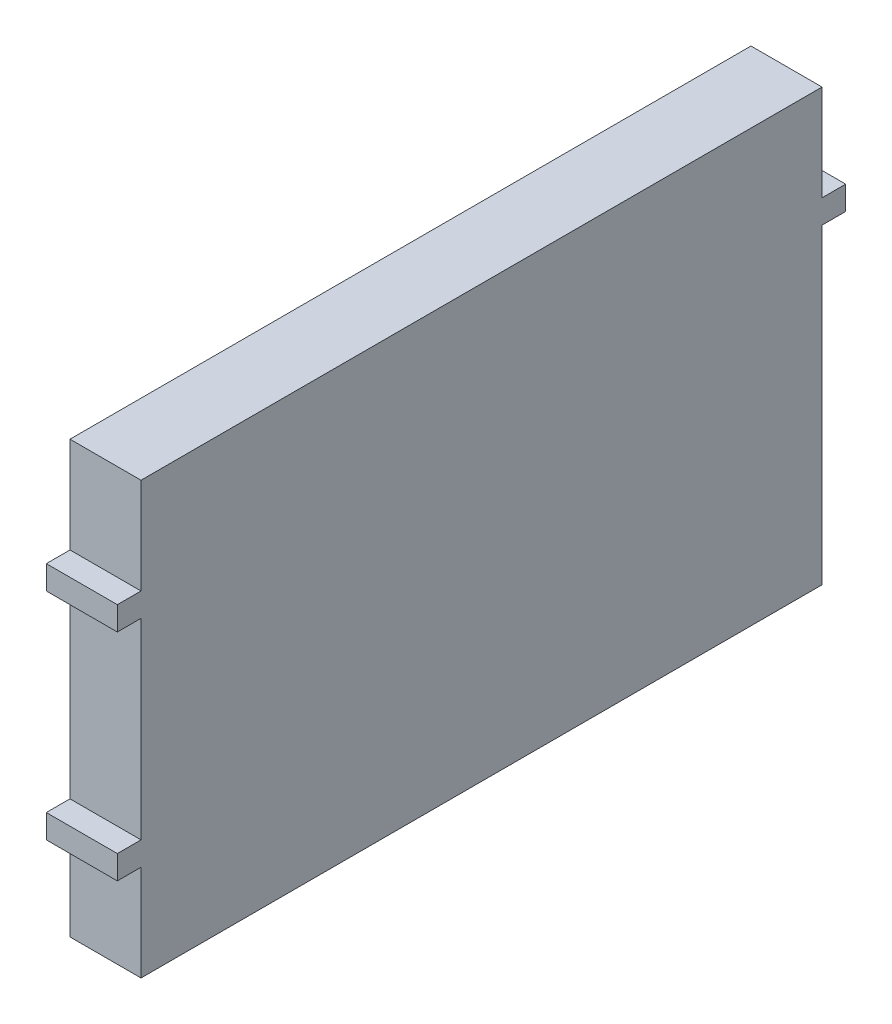
ISO-10303-21;
HEADER;
FILE_DESCRIPTION(('STEP AP214'),'2;1');
FILE_NAME('part.step','',(''),(''),'','','');
FILE_SCHEMA(('AUTOMOTIVE_DESIGN { 1 0 10303 214 1 1 1 1 }'));
ENDSEC;
DATA;
#1=APPLICATION_CONTEXT('core data for automotive mechanical design processes');
#2=APPLICATION_PROTOCOL_DEFINITION('international standard','automotive_design',2000,#1);
#3=PRODUCT_CONTEXT('',#1,'mechanical');
#4=PRODUCT('Part','Part','',(#3));
#5=PRODUCT_RELATED_PRODUCT_CATEGORY('part','',(#4));
#6=PRODUCT_DEFINITION_FORMATION('','',#4);
#7=PRODUCT_DEFINITION_CONTEXT('part definition',#1,'design');
#8=PRODUCT_DEFINITION('design','',#6,#7);
#9=PRODUCT_DEFINITION_SHAPE('','',#8);
#10=(LENGTH_UNIT() NAMED_UNIT(*) SI_UNIT(.MILLI.,.METRE.));
#11=(NAMED_UNIT(*) PLANE_ANGLE_UNIT() SI_UNIT($,.RADIAN.));
#12=(NAMED_UNIT(*) SI_UNIT($,.STERADIAN.) SOLID_ANGLE_UNIT());
#13=UNCERTAINTY_MEASURE_WITH_UNIT(LENGTH_MEASURE(1.E-05),#10,'distance_accuracy_value','');
#14=(GEOMETRIC_REPRESENTATION_CONTEXT(3) GLOBAL_UNCERTAINTY_ASSIGNED_CONTEXT((#13)) GLOBAL_UNIT_ASSIGNED_CONTEXT((#10,
#11,#12)) REPRESENTATION_CONTEXT('',''));
#15=CARTESIAN_POINT('',(0.,0.,0.));
#16=DIRECTION('',(0.,0.,1.));
#17=DIRECTION('',(1.,0.,0.));
#18=AXIS2_PLACEMENT_3D('',#15,#16,#17);
#19=CARTESIAN_POINT('',(365.992991784874,377.766708454733,776.88119407791));
#20=DIRECTION('',(0.,0.,-1.));
#21=DIRECTION('',(-1.,0.,0.));
#22=AXIS2_PLACEMENT_3D('',#19,#20,#21);
#23=PLANE('',#22);
#24=DIRECTION('',(0.,-1.,0.));
#25=VECTOR('',#24,1.);
#26=CARTESIAN_POINT('',(252.542706630704,377.766708454733,776.88119407791));
#27=LINE('',#26,#25);
#28=CARTESIAN_POINT('',(252.542706630704,377.766708454733,776.88119407791));
#29=VERTEX_POINT('',#28);
#30=CARTESIAN_POINT('',(252.542706630704,374.591708454733,776.88119407791));
#31=VERTEX_POINT('',#30);
#32=EDGE_CURVE('E204',#29,#31,#27,.T.);
#33=ORIENTED_EDGE('',*,*,#32,.F.);
#34=DIRECTION('',(-1.,0.,0.));
#35=VECTOR('',#34,1.);
#36=CARTESIAN_POINT('',(365.992991784874,377.766708454733,776.88119407791));
#37=LINE('',#36,#35);
#38=CARTESIAN_POINT('',(243.017706630704,377.766708454733,776.88119407791));
#39=VERTEX_POINT('',#38);
#40=EDGE_CURVE('E37',#29,#39,#37,.T.);
#41=ORIENTED_EDGE('',*,*,#40,.T.);
#42=DIRECTION('',(0.,-1.,0.));
#43=VECTOR('',#42,1.);
#44=CARTESIAN_POINT('',(243.017706630704,377.766708454733,776.88119407791));
#45=LINE('',#44,#43);
#46=CARTESIAN_POINT('',(243.017706630704,374.591708454733,776.88119407791));
#47=VERTEX_POINT('',#46);
#48=EDGE_CURVE('E212',#39,#47,#45,.T.);
#49=ORIENTED_EDGE('',*,*,#48,.T.);
#50=DIRECTION('',(-1.,0.,0.));
#51=VECTOR('',#50,1.);
#52=CARTESIAN_POINT('',(365.992991784874,374.591708454733,776.88119407791));
#53=LINE('',#52,#51);
#54=EDGE_CURVE('E120',#31,#47,#53,.T.);
#55=ORIENTED_EDGE('',*,*,#54,.F.);
#56=EDGE_LOOP('',(#33,#41,#49,#55));
#57=FACE_BOUND('',#56,.T.);
#58=ADVANCED_FACE('F33',(#57),#23,.F.);
#59=CARTESIAN_POINT('',(365.992991784874,374.591708454733,776.88119407791));
#60=DIRECTION('',(0.,1.,0.));
#61=DIRECTION('',(-1.,0.,0.));
#62=AXIS2_PLACEMENT_3D('',#59,#60,#61);
#63=PLANE('',#62);
#64=DIRECTION('',(0.,0.,-1.));
#65=VECTOR('',#64,1.);
#66=CARTESIAN_POINT('',(252.542706630704,374.591708454733,776.88119407791));
#67=LINE('',#66,#65);
#68=CARTESIAN_POINT('',(252.542706630704,374.591708454733,773.70619407791));
#69=VERTEX_POINT('',#68);
#70=EDGE_CURVE('E127',#31,#69,#67,.T.);
#71=ORIENTED_EDGE('',*,*,#70,.F.);
#72=ORIENTED_EDGE('',*,*,#54,.T.);
#73=DIRECTION('',(0.,0.,-1.));
#74=VECTOR('',#73,1.);
#75=CARTESIAN_POINT('',(243.017706630704,374.591708454733,776.88119407791));
#76=LINE('',#75,#74);
#77=CARTESIAN_POINT('',(243.017706630704,374.591708454733,773.70619407791));
#78=VERTEX_POINT('',#77);
#79=EDGE_CURVE('E211',#47,#78,#76,.T.);
#80=ORIENTED_EDGE('',*,*,#79,.T.);
#81=DIRECTION('',(-1.,0.,0.));
#82=VECTOR('',#81,1.);
#83=CARTESIAN_POINT('',(365.992991784874,374.591708454733,773.70619407791));
#84=LINE('',#83,#82);
#85=EDGE_CURVE('E213',#69,#78,#84,.T.);
#86=ORIENTED_EDGE('',*,*,#85,.F.);
#87=EDGE_LOOP('',(#71,#72,#80,#86));
#88=FACE_BOUND('',#87,.T.);
#89=ADVANCED_FACE('F282',(#88),#63,.F.);
#90=CARTESIAN_POINT('',(365.992991784874,361.732958454733,773.70619407791));
#91=DIRECTION('',(0.,0.,-1.));
#92=DIRECTION('',(-1.,0.,0.));
#93=AXIS2_PLACEMENT_3D('',#90,#91,#92);
#94=PLANE('',#93);
#95=DIRECTION('',(0.,-1.,0.));
#96=VECTOR('',#95,1.);
#97=CARTESIAN_POINT('',(252.542706630704,361.732958454733,773.70619407791));
#98=LINE('',#97,#96);
#99=CARTESIAN_POINT('',(252.542706630704,361.732958454733,773.70619407791));
#100=VERTEX_POINT('',#99);
#101=EDGE_CURVE('E200',#69,#100,#98,.T.);
#102=ORIENTED_EDGE('',*,*,#101,.F.);
#103=ORIENTED_EDGE('',*,*,#85,.T.);
#104=DIRECTION('',(0.,-1.,0.));
#105=VECTOR('',#104,1.);
#106=CARTESIAN_POINT('',(243.017706630704,361.732958454733,773.70619407791));
#107=LINE('',#106,#105);
#108=CARTESIAN_POINT('',(243.017706630704,361.732958454733,773.70619407791));
#109=VERTEX_POINT('',#108);
#110=EDGE_CURVE('E215',#78,#109,#107,.T.);
#111=ORIENTED_EDGE('',*,*,#110,.T.);
#112=DIRECTION('',(-1.,0.,0.));
#113=VECTOR('',#112,1.);
#114=CARTESIAN_POINT('',(365.992991784874,361.732958454733,773.70619407791));
#115=LINE('',#114,#113);
#116=EDGE_CURVE('E216',#100,#109,#115,.T.);
#117=ORIENTED_EDGE('',*,*,#116,.F.);
#118=EDGE_LOOP('',(#102,#103,#111,#117));
#119=FACE_BOUND('',#118,.T.);
#120=ADVANCED_FACE('F285',(#119),#94,.F.);
#121=CARTESIAN_POINT('',(365.992991784874,361.732958454733,682.42494407791));
#122=DIRECTION('',(0.,1.,0.));
#123=DIRECTION('',(-1.,0.,0.));
#124=AXIS2_PLACEMENT_3D('',#121,#122,#123);
#125=PLANE('',#124);
#126=DIRECTION('',(0.,0.,-1.));
#127=VECTOR('',#126,1.);
#128=CARTESIAN_POINT('',(252.542706630704,361.732958454733,682.42494407791));
#129=LINE('',#128,#127);
#130=CARTESIAN_POINT('',(252.542706630704,361.732958454733,682.42494407791));
#131=VERTEX_POINT('',#130);
#132=EDGE_CURVE('E197',#100,#131,#129,.T.);
#133=ORIENTED_EDGE('',*,*,#132,.F.);
#134=ORIENTED_EDGE('',*,*,#116,.T.);
#135=DIRECTION('',(0.,0.,-1.));
#136=VECTOR('',#135,1.);
#137=CARTESIAN_POINT('',(243.017706630704,361.732958454733,682.42494407791));
#138=LINE('',#137,#136);
#139=CARTESIAN_POINT('',(243.017706630704,361.732958454733,682.42494407791));
#140=VERTEX_POINT('',#139);
#141=EDGE_CURVE('E218',#109,#140,#138,.T.);
#142=ORIENTED_EDGE('',*,*,#141,.T.);
#143=DIRECTION('',(-1.,0.,0.));
#144=VECTOR('',#143,1.);
#145=CARTESIAN_POINT('',(365.992991784874,361.732958454733,682.42494407791));
#146=LINE('',#145,#144);
#147=EDGE_CURVE('E219',#131,#140,#146,.T.);
#148=ORIENTED_EDGE('',*,*,#147,.F.);
#149=EDGE_LOOP('',(#133,#134,#142,#148));
#150=FACE_BOUND('',#149,.T.);
#151=ADVANCED_FACE('F287',(#150),#125,.F.);
#152=CARTESIAN_POINT('',(365.992991784874,403.484208454733,682.42494407791));
#153=DIRECTION('',(0.,0.,1.));
#154=DIRECTION('',(1.,0.,0.));
#155=AXIS2_PLACEMENT_3D('',#152,#153,#154);
#156=PLANE('',#155);
#157=DIRECTION('',(0.,1.,0.));
#158=VECTOR('',#157,1.);
#159=CARTESIAN_POINT('',(252.542706630704,403.484208454733,682.42494407791));
#160=LINE('',#159,#158);
#161=CARTESIAN_POINT('',(252.542706630704,403.484208454733,682.42494407791));
#162=VERTEX_POINT('',#161);
#163=EDGE_CURVE('E194',#131,#162,#160,.T.);
#164=ORIENTED_EDGE('',*,*,#163,.F.);
#165=ORIENTED_EDGE('',*,*,#147,.T.);
#166=DIRECTION('',(0.,1.,0.));
#167=VECTOR('',#166,1.);
#168=CARTESIAN_POINT('',(243.017706630704,403.484208454733,682.42494407791));
#169=LINE('',#168,#167);
#170=CARTESIAN_POINT('',(243.017706630704,403.484208454733,682.42494407791));
#171=VERTEX_POINT('',#170);
#172=EDGE_CURVE('E221',#140,#171,#169,.T.);
#173=ORIENTED_EDGE('',*,*,#172,.T.);
#174=DIRECTION('',(-1.,0.,0.));
#175=VECTOR('',#174,1.);
#176=CARTESIAN_POINT('',(365.992991784874,403.484208454733,682.42494407791));
#177=LINE('',#176,#175);
#178=EDGE_CURVE('E222',#162,#171,#177,.T.);
#179=ORIENTED_EDGE('',*,*,#178,.F.);
#180=EDGE_LOOP('',(#164,#165,#173,#179));
#181=FACE_BOUND('',#180,.T.);
#182=ADVANCED_FACE('F291',(#181),#156,.F.);
#183=CARTESIAN_POINT('',(365.992991784874,403.484208454733,682.42494407791));
#184=DIRECTION('',(0.,1.,0.));
#185=DIRECTION('',(-1.,0.,0.));
#186=AXIS2_PLACEMENT_3D('',#183,#184,#185);
#187=PLANE('',#186);
#188=DIRECTION('',(0.,0.,-1.));
#189=VECTOR('',#188,1.);
#190=CARTESIAN_POINT('',(252.542706630704,403.484208454733,682.42494407791));
#191=LINE('',#190,#189);
#192=CARTESIAN_POINT('',(252.542706630704,403.484208454733,679.24994407791));
#193=VERTEX_POINT('',#192);
#194=EDGE_CURVE('E191',#162,#193,#191,.T.);
#195=ORIENTED_EDGE('',*,*,#194,.F.);
#196=ORIENTED_EDGE('',*,*,#178,.T.);
#197=DIRECTION('',(0.,0.,-1.));
#198=VECTOR('',#197,1.);
#199=CARTESIAN_POINT('',(243.017706630704,403.484208454733,682.42494407791));
#200=LINE('',#199,#198);
#201=CARTESIAN_POINT('',(243.017706630704,403.484208454733,679.24994407791));
#202=VERTEX_POINT('',#201);
#203=EDGE_CURVE('E224',#171,#202,#200,.T.);
#204=ORIENTED_EDGE('',*,*,#203,.T.);
#205=DIRECTION('',(-1.,0.,0.));
#206=VECTOR('',#205,1.);
#207=CARTESIAN_POINT('',(365.992991784874,403.484208454733,679.24994407791));
#208=LINE('',#207,#206);
#209=EDGE_CURVE('E225',#193,#202,#208,.T.);
#210=ORIENTED_EDGE('',*,*,#209,.F.);
#211=EDGE_LOOP('',(#195,#196,#204,#210));
#212=FACE_BOUND('',#211,.T.);
#213=ADVANCED_FACE('F296',(#212),#187,.F.);
#214=CARTESIAN_POINT('',(365.992991784874,403.484208454733,679.24994407791));
#215=DIRECTION('',(0.,0.,1.));
#216=DIRECTION('',(1.,0.,0.));
#217=AXIS2_PLACEMENT_3D('',#214,#215,#216);
#218=PLANE('',#217);
#219=DIRECTION('',(0.,1.,0.));
#220=VECTOR('',#219,1.);
#221=CARTESIAN_POINT('',(252.542706630704,403.484208454733,679.24994407791));
#222=LINE('',#221,#220);
#223=CARTESIAN_POINT('',(252.542706630704,406.659208454733,679.24994407791));
#224=VERTEX_POINT('',#223);
#225=EDGE_CURVE('E188',#193,#224,#222,.T.);
#226=ORIENTED_EDGE('',*,*,#225,.F.);
#227=ORIENTED_EDGE('',*,*,#209,.T.);
#228=DIRECTION('',(0.,1.,0.));
#229=VECTOR('',#228,1.);
#230=CARTESIAN_POINT('',(243.017706630704,403.484208454733,679.24994407791));
#231=LINE('',#230,#229);
#232=CARTESIAN_POINT('',(243.017706630704,406.659208454733,679.24994407791));
#233=VERTEX_POINT('',#232);
#234=EDGE_CURVE('E227',#202,#233,#231,.T.);
#235=ORIENTED_EDGE('',*,*,#234,.T.);
#236=DIRECTION('',(-1.,0.,0.));
#237=VECTOR('',#236,1.);
#238=CARTESIAN_POINT('',(365.992991784874,406.659208454733,679.24994407791));
#239=LINE('',#238,#237);
#240=EDGE_CURVE('E228',#224,#233,#239,.T.);
#241=ORIENTED_EDGE('',*,*,#240,.F.);
#242=EDGE_LOOP('',(#226,#227,#235,#241));
#243=FACE_BOUND('',#242,.T.);
#244=ADVANCED_FACE('F299',(#243),#218,.F.);
#245=CARTESIAN_POINT('',(365.992991784874,406.659208454733,679.24994407791));
#246=DIRECTION('',(0.,-1.,0.));
#247=DIRECTION('',(1.,0.,0.));
#248=AXIS2_PLACEMENT_3D('',#245,#246,#247);
#249=PLANE('',#248);
#250=DIRECTION('',(0.,0.,1.));
#251=VECTOR('',#250,1.);
#252=CARTESIAN_POINT('',(252.542706630704,406.659208454733,679.24994407791));
#253=LINE('',#252,#251);
#254=CARTESIAN_POINT('',(252.542706630704,406.659208454733,682.42494407791));
#255=VERTEX_POINT('',#254);
#256=EDGE_CURVE('E185',#224,#255,#253,.T.);
#257=ORIENTED_EDGE('',*,*,#256,.F.);
#258=ORIENTED_EDGE('',*,*,#240,.T.);
#259=DIRECTION('',(0.,0.,1.));
#260=VECTOR('',#259,1.);
#261=CARTESIAN_POINT('',(243.017706630704,406.659208454733,679.24994407791));
#262=LINE('',#261,#260);
#263=CARTESIAN_POINT('',(243.017706630704,406.659208454733,682.42494407791));
#264=VERTEX_POINT('',#263);
#265=EDGE_CURVE('E230',#233,#264,#262,.T.);
#266=ORIENTED_EDGE('',*,*,#265,.T.);
#267=DIRECTION('',(-1.,0.,0.));
#268=VECTOR('',#267,1.);
#269=CARTESIAN_POINT('',(365.992991784874,406.659208454733,682.42494407791));
#270=LINE('',#269,#268);
#271=EDGE_CURVE('E231',#255,#264,#270,.T.);
#272=ORIENTED_EDGE('',*,*,#271,.F.);
#273=EDGE_LOOP('',(#257,#258,#266,#272));
#274=FACE_BOUND('',#273,.T.);
#275=ADVANCED_FACE('F303',(#274),#249,.F.);
#276=CARTESIAN_POINT('',(365.992991784874,419.517958454733,682.42494407791));
#277=DIRECTION('',(0.,0.,1.));
#278=DIRECTION('',(1.,0.,0.));
#279=AXIS2_PLACEMENT_3D('',#276,#277,#278);
#280=PLANE('',#279);
#281=DIRECTION('',(0.,1.,0.));
#282=VECTOR('',#281,1.);
#283=CARTESIAN_POINT('',(252.542706630704,419.517958454733,682.42494407791));
#284=LINE('',#283,#282);
#285=CARTESIAN_POINT('',(252.542706630704,419.517958454733,682.42494407791));
#286=VERTEX_POINT('',#285);
#287=EDGE_CURVE('E182',#255,#286,#284,.T.);
#288=ORIENTED_EDGE('',*,*,#287,.F.);
#289=ORIENTED_EDGE('',*,*,#271,.T.);
#290=DIRECTION('',(0.,1.,0.));
#291=VECTOR('',#290,1.);
#292=CARTESIAN_POINT('',(243.017706630704,419.517958454733,682.42494407791));
#293=LINE('',#292,#291);
#294=CARTESIAN_POINT('',(243.017706630704,419.517958454733,682.42494407791));
#295=VERTEX_POINT('',#294);
#296=EDGE_CURVE('E233',#264,#295,#293,.T.);
#297=ORIENTED_EDGE('',*,*,#296,.T.);
#298=DIRECTION('',(-1.,0.,0.));
#299=VECTOR('',#298,1.);
#300=CARTESIAN_POINT('',(365.992991784874,419.517958454733,682.42494407791));
#301=LINE('',#300,#299);
#302=EDGE_CURVE('E234',#286,#295,#301,.T.);
#303=ORIENTED_EDGE('',*,*,#302,.F.);
#304=EDGE_LOOP('',(#288,#289,#297,#303));
#305=FACE_BOUND('',#304,.T.);
#306=ADVANCED_FACE('F308',(#305),#280,.F.);
#307=CARTESIAN_POINT('',(365.992991784874,419.517958454733,773.70619407791));
#308=DIRECTION('',(0.,-1.,0.));
#309=DIRECTION('',(1.,0.,0.));
#310=AXIS2_PLACEMENT_3D('',#307,#308,#309);
#311=PLANE('',#310);
#312=DIRECTION('',(0.,0.,1.));
#313=VECTOR('',#312,1.);
#314=CARTESIAN_POINT('',(252.542706630704,419.517958454733,773.70619407791));
#315=LINE('',#314,#313);
#316=CARTESIAN_POINT('',(252.542706630704,419.517958454733,773.70619407791));
#317=VERTEX_POINT('',#316);
#318=EDGE_CURVE('E179',#286,#317,#315,.T.);
#319=ORIENTED_EDGE('',*,*,#318,.F.);
#320=ORIENTED_EDGE('',*,*,#302,.T.);
#321=DIRECTION('',(0.,0.,1.));
#322=VECTOR('',#321,1.);
#323=CARTESIAN_POINT('',(243.017706630704,419.517958454733,773.70619407791));
#324=LINE('',#323,#322);
#325=CARTESIAN_POINT('',(243.017706630704,419.517958454733,773.70619407791));
#326=VERTEX_POINT('',#325);
#327=EDGE_CURVE('E236',#295,#326,#324,.T.);
#328=ORIENTED_EDGE('',*,*,#327,.T.);
#329=DIRECTION('',(-1.,0.,0.));
#330=VECTOR('',#329,1.);
#331=CARTESIAN_POINT('',(365.992991784874,419.517958454733,773.70619407791));
#332=LINE('',#331,#330);
#333=EDGE_CURVE('E237',#317,#326,#332,.T.);
#334=ORIENTED_EDGE('',*,*,#333,.F.);
#335=EDGE_LOOP('',(#319,#320,#328,#334));
#336=FACE_BOUND('',#335,.T.);
#337=ADVANCED_FACE('F311',(#336),#311,.F.);
#338=CARTESIAN_POINT('',(365.992991784874,406.659208454733,773.70619407791));
#339=DIRECTION('',(0.,0.,-1.));
#340=DIRECTION('',(-1.,0.,0.));
#341=AXIS2_PLACEMENT_3D('',#338,#339,#340);
#342=PLANE('',#341);
#343=DIRECTION('',(0.,-1.,0.));
#344=VECTOR('',#343,1.);
#345=CARTESIAN_POINT('',(252.542706630704,406.659208454733,773.70619407791));
#346=LINE('',#345,#344);
#347=CARTESIAN_POINT('',(252.542706630704,406.659208454733,773.70619407791));
#348=VERTEX_POINT('',#347);
#349=EDGE_CURVE('E176',#317,#348,#346,.T.);
#350=ORIENTED_EDGE('',*,*,#349,.F.);
#351=ORIENTED_EDGE('',*,*,#333,.T.);
#352=DIRECTION('',(0.,-1.,0.));
#353=VECTOR('',#352,1.);
#354=CARTESIAN_POINT('',(243.017706630704,406.659208454733,773.70619407791));
#355=LINE('',#354,#353);
#356=CARTESIAN_POINT('',(243.017706630704,406.659208454733,773.70619407791));
#357=VERTEX_POINT('',#356);
#358=EDGE_CURVE('E239',#326,#357,#355,.T.);
#359=ORIENTED_EDGE('',*,*,#358,.T.);
#360=DIRECTION('',(-1.,0.,0.));
#361=VECTOR('',#360,1.);
#362=CARTESIAN_POINT('',(365.992991784874,406.659208454733,773.70619407791));
#363=LINE('',#362,#361);
#364=EDGE_CURVE('E240',#348,#357,#363,.T.);
#365=ORIENTED_EDGE('',*,*,#364,.F.);
#366=EDGE_LOOP('',(#350,#351,#359,#365));
#367=FACE_BOUND('',#366,.T.);
#368=ADVANCED_FACE('F315',(#367),#342,.F.);
#369=CARTESIAN_POINT('',(365.992991784874,406.659208454733,773.70619407791));
#370=DIRECTION('',(0.,-1.,0.));
#371=DIRECTION('',(1.,0.,0.));
#372=AXIS2_PLACEMENT_3D('',#369,#370,#371);
#373=PLANE('',#372);
#374=DIRECTION('',(0.,0.,1.));
#375=VECTOR('',#374,1.);
#376=CARTESIAN_POINT('',(252.542706630704,406.659208454733,773.70619407791));
#377=LINE('',#376,#375);
#378=CARTESIAN_POINT('',(252.542706630704,406.659208454733,776.88119407791));
#379=VERTEX_POINT('',#378);
#380=EDGE_CURVE('E171',#348,#379,#377,.T.);
#381=ORIENTED_EDGE('',*,*,#380,.F.);
#382=ORIENTED_EDGE('',*,*,#364,.T.);
#383=DIRECTION('',(0.,0.,1.));
#384=VECTOR('',#383,1.);
#385=CARTESIAN_POINT('',(243.017706630704,406.659208454733,773.70619407791));
#386=LINE('',#385,#384);
#387=CARTESIAN_POINT('',(243.017706630704,406.659208454733,776.88119407791));
#388=VERTEX_POINT('',#387);
#389=EDGE_CURVE('E242',#357,#388,#386,.T.);
#390=ORIENTED_EDGE('',*,*,#389,.T.);
#391=DIRECTION('',(-1.,0.,0.));
#392=VECTOR('',#391,1.);
#393=CARTESIAN_POINT('',(365.992991784874,406.659208454733,776.88119407791));
#394=LINE('',#393,#392);
#395=EDGE_CURVE('E243',#379,#388,#394,.T.);
#396=ORIENTED_EDGE('',*,*,#395,.F.);
#397=EDGE_LOOP('',(#381,#382,#390,#396));
#398=FACE_BOUND('',#397,.T.);
#399=ADVANCED_FACE('F320',(#398),#373,.F.);
#400=CARTESIAN_POINT('',(365.992991784874,406.659208454733,776.88119407791));
#401=DIRECTION('',(0.,0.,-1.));
#402=DIRECTION('',(-1.,0.,0.));
#403=AXIS2_PLACEMENT_3D('',#400,#401,#402);
#404=PLANE('',#403);
#405=DIRECTION('',(0.,-1.,0.));
#406=VECTOR('',#405,1.);
#407=CARTESIAN_POINT('',(252.542706630704,406.659208454733,776.88119407791));
#408=LINE('',#407,#406);
#409=CARTESIAN_POINT('',(252.542706630704,403.484208454733,776.88119407791));
#410=VERTEX_POINT('',#409);
#411=EDGE_CURVE('E169',#379,#410,#408,.T.);
#412=ORIENTED_EDGE('',*,*,#411,.F.);
#413=ORIENTED_EDGE('',*,*,#395,.T.);
#414=DIRECTION('',(0.,-1.,0.));
#415=VECTOR('',#414,1.);
#416=CARTESIAN_POINT('',(243.017706630704,406.659208454733,776.88119407791));
#417=LINE('',#416,#415);
#418=CARTESIAN_POINT('',(243.017706630704,403.484208454733,776.88119407791));
#419=VERTEX_POINT('',#418);
#420=EDGE_CURVE('E245',#388,#419,#417,.T.);
#421=ORIENTED_EDGE('',*,*,#420,.T.);
#422=DIRECTION('',(-1.,0.,0.));
#423=VECTOR('',#422,1.);
#424=CARTESIAN_POINT('',(365.992991784874,403.484208454733,776.88119407791));
#425=LINE('',#424,#423);
#426=EDGE_CURVE('E246',#410,#419,#425,.T.);
#427=ORIENTED_EDGE('',*,*,#426,.F.);
#428=EDGE_LOOP('',(#412,#413,#421,#427));
#429=FACE_BOUND('',#428,.T.);
#430=ADVANCED_FACE('F323',(#429),#404,.F.);
#431=CARTESIAN_POINT('',(365.992991784874,403.484208454733,776.88119407791));
#432=DIRECTION('',(0.,1.,0.));
#433=DIRECTION('',(-1.,0.,0.));
#434=AXIS2_PLACEMENT_3D('',#431,#432,#433);
#435=PLANE('',#434);
#436=DIRECTION('',(0.,0.,-1.));
#437=VECTOR('',#436,1.);
#438=CARTESIAN_POINT('',(252.542706630704,403.484208454733,776.88119407791));
#439=LINE('',#438,#437);
#440=CARTESIAN_POINT('',(252.542706630704,403.484208454733,773.70619407791));
#441=VERTEX_POINT('',#440);
#442=EDGE_CURVE('E42',#410,#441,#439,.T.);
#443=ORIENTED_EDGE('',*,*,#442,.F.);
#444=ORIENTED_EDGE('',*,*,#426,.T.);
#445=DIRECTION('',(0.,0.,-1.));
#446=VECTOR('',#445,1.);
#447=CARTESIAN_POINT('',(243.017706630704,403.484208454733,776.88119407791));
#448=LINE('',#447,#446);
#449=CARTESIAN_POINT('',(243.017706630704,403.484208454733,773.70619407791));
#450=VERTEX_POINT('',#449);
#451=EDGE_CURVE('E163',#419,#450,#448,.T.);
#452=ORIENTED_EDGE('',*,*,#451,.T.);
#453=DIRECTION('',(-1.,0.,0.));
#454=VECTOR('',#453,1.);
#455=CARTESIAN_POINT('',(365.992991784874,403.484208454733,773.70619407791));
#456=LINE('',#455,#454);
#457=EDGE_CURVE('E154',#441,#450,#456,.T.);
#458=ORIENTED_EDGE('',*,*,#457,.F.);
#459=EDGE_LOOP('',(#443,#444,#452,#458));
#460=FACE_BOUND('',#459,.T.);
#461=ADVANCED_FACE('F160',(#460),#435,.F.);
#462=CARTESIAN_POINT('',(365.992991784874,377.766708454733,773.70619407791));
#463=DIRECTION('',(0.,0.,-1.));
#464=DIRECTION('',(-1.,0.,0.));
#465=AXIS2_PLACEMENT_3D('',#462,#463,#464);
#466=PLANE('',#465);
#467=DIRECTION('',(0.,-1.,0.));
#468=VECTOR('',#467,1.);
#469=CARTESIAN_POINT('',(252.542706630704,377.766708454733,773.70619407791));
#470=LINE('',#469,#468);
#471=CARTESIAN_POINT('',(252.542706630704,377.766708454733,773.70619407791));
#472=VERTEX_POINT('',#471);
#473=EDGE_CURVE('E11',#441,#472,#470,.T.);
#474=ORIENTED_EDGE('',*,*,#473,.F.);
#475=ORIENTED_EDGE('',*,*,#457,.T.);
#476=DIRECTION('',(0.,-1.,0.));
#477=VECTOR('',#476,1.);
#478=CARTESIAN_POINT('',(243.017706630704,377.766708454733,773.70619407791));
#479=LINE('',#478,#477);
#480=CARTESIAN_POINT('',(243.017706630704,377.766708454733,773.70619407791));
#481=VERTEX_POINT('',#480);
#482=EDGE_CURVE('E165',#450,#481,#479,.T.);
#483=ORIENTED_EDGE('',*,*,#482,.T.);
#484=DIRECTION('',(-1.,0.,0.));
#485=VECTOR('',#484,1.);
#486=CARTESIAN_POINT('',(365.992991784874,377.766708454733,773.70619407791));
#487=LINE('',#486,#485);
#488=EDGE_CURVE('E55',#472,#481,#487,.T.);
#489=ORIENTED_EDGE('',*,*,#488,.F.);
#490=EDGE_LOOP('',(#474,#475,#483,#489));
#491=FACE_BOUND('',#490,.T.);
#492=ADVANCED_FACE('F153',(#491),#466,.F.);
#493=CARTESIAN_POINT('',(365.992991784874,377.766708454733,773.70619407791));
#494=DIRECTION('',(0.,-1.,0.));
#495=DIRECTION('',(1.,0.,0.));
#496=AXIS2_PLACEMENT_3D('',#493,#494,#495);
#497=PLANE('',#496);
#498=DIRECTION('',(0.,0.,1.));
#499=VECTOR('',#498,1.);
#500=CARTESIAN_POINT('',(252.542706630704,377.766708454733,773.70619407791));
#501=LINE('',#500,#499);
#502=EDGE_CURVE('E207',#472,#29,#501,.T.);
#503=ORIENTED_EDGE('',*,*,#502,.F.);
#504=ORIENTED_EDGE('',*,*,#488,.T.);
#505=DIRECTION('',(0.,0.,1.));
#506=VECTOR('',#505,1.);
#507=CARTESIAN_POINT('',(243.017706630704,377.766708454733,773.70619407791));
#508=LINE('',#507,#506);
#509=EDGE_CURVE('E209',#481,#39,#508,.T.);
#510=ORIENTED_EDGE('',*,*,#509,.T.);
#511=ORIENTED_EDGE('',*,*,#40,.F.);
#512=EDGE_LOOP('',(#503,#504,#510,#511));
#513=FACE_BOUND('',#512,.T.);
#514=ADVANCED_FACE('F277',(#513),#497,.F.);
#515=CARTESIAN_POINT('',(243.017706630704,0.,0.));
#516=DIRECTION('',(1.,0.,0.));
#517=DIRECTION('',(0.,0.,-1.));
#518=AXIS2_PLACEMENT_3D('',#515,#516,#517);
#519=PLANE('',#518);
#520=ORIENTED_EDGE('',*,*,#48,.F.);
#521=ORIENTED_EDGE('',*,*,#509,.F.);
#522=ORIENTED_EDGE('',*,*,#482,.F.);
#523=ORIENTED_EDGE('',*,*,#451,.F.);
#524=ORIENTED_EDGE('',*,*,#420,.F.);
#525=ORIENTED_EDGE('',*,*,#389,.F.);
#526=ORIENTED_EDGE('',*,*,#358,.F.);
#527=ORIENTED_EDGE('',*,*,#327,.F.);
#528=ORIENTED_EDGE('',*,*,#296,.F.);
#529=ORIENTED_EDGE('',*,*,#265,.F.);
#530=ORIENTED_EDGE('',*,*,#234,.F.);
#531=ORIENTED_EDGE('',*,*,#203,.F.);
#532=ORIENTED_EDGE('',*,*,#172,.F.);
#533=ORIENTED_EDGE('',*,*,#141,.F.);
#534=ORIENTED_EDGE('',*,*,#110,.F.);
#535=ORIENTED_EDGE('',*,*,#79,.F.);
#536=EDGE_LOOP('',(#520,#521,#522,#523,#524,#525,#526,#527,#528,#529,#530,#531,#532,#533,#534,#535));
#537=FACE_BOUND('',#536,.T.);
#538=ADVANCED_FACE('F279',(#537),#519,.F.);
#539=CARTESIAN_POINT('',(252.542706630704,403.484208454733,776.88119407791));
#540=DIRECTION('',(1.,0.,0.));
#541=DIRECTION('',(0.,0.,-1.));
#542=AXIS2_PLACEMENT_3D('',#539,#540,#541);
#543=PLANE('',#542);
#544=ORIENTED_EDGE('',*,*,#502,.T.);
#545=ORIENTED_EDGE('',*,*,#32,.T.);
#546=ORIENTED_EDGE('',*,*,#70,.T.);
#547=ORIENTED_EDGE('',*,*,#101,.T.);
#548=ORIENTED_EDGE('',*,*,#132,.T.);
#549=ORIENTED_EDGE('',*,*,#163,.T.);
#550=ORIENTED_EDGE('',*,*,#194,.T.);
#551=ORIENTED_EDGE('',*,*,#225,.T.);
#552=ORIENTED_EDGE('',*,*,#256,.T.);
#553=ORIENTED_EDGE('',*,*,#287,.T.);
#554=ORIENTED_EDGE('',*,*,#318,.T.);
#555=ORIENTED_EDGE('',*,*,#349,.T.);
#556=ORIENTED_EDGE('',*,*,#380,.T.);
#557=ORIENTED_EDGE('',*,*,#411,.T.);
#558=ORIENTED_EDGE('',*,*,#442,.T.);
#559=ORIENTED_EDGE('',*,*,#473,.T.);
#560=EDGE_LOOP('',(#544,#545,#546,#547,#548,#549,#550,#551,#552,#553,#554,#555,#556,#557,#558,#559));
#561=FACE_BOUND('',#560,.T.);
#562=ADVANCED_FACE('F35',(#561),#543,.T.);
#563=CLOSED_SHELL('',(#58,#89,#120,#151,#182,#213,#244,#275,#306,#337,#368,#399,#430,#461,#492,
#514,#538,#562));
#564=MANIFOLD_SOLID_BREP('B2',#563);
#565=ADVANCED_BREP_SHAPE_REPRESENTATION('',(#18,#564),#14);
#566=SHAPE_DEFINITION_REPRESENTATION(#9,#565);
ENDSEC;
END-ISO-10303-21;
